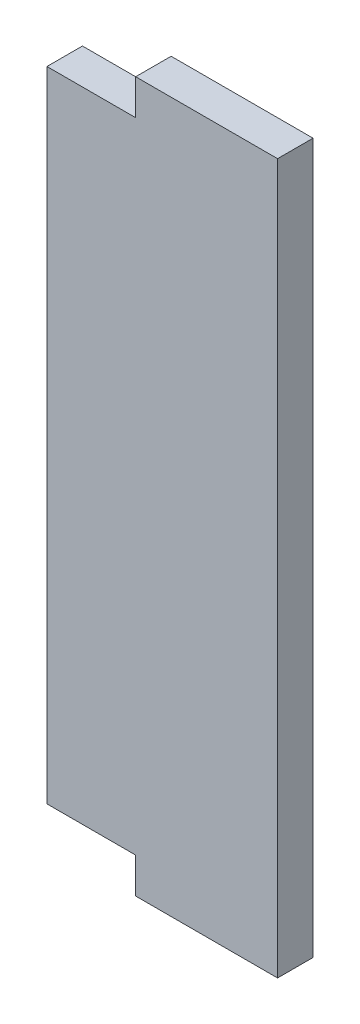
ISO-10303-21;
HEADER;
FILE_DESCRIPTION(('STEP AP214'),'2;1');
FILE_NAME('part.step','',(''),(''),'','','');
FILE_SCHEMA(('AUTOMOTIVE_DESIGN { 1 0 10303 214 1 1 1 1 }'));
ENDSEC;
DATA;
#1=APPLICATION_CONTEXT('core data for automotive mechanical design processes');
#2=APPLICATION_PROTOCOL_DEFINITION('international standard','automotive_design',2000,#1);
#3=PRODUCT_CONTEXT('',#1,'mechanical');
#4=PRODUCT('Part','Part','',(#3));
#5=PRODUCT_RELATED_PRODUCT_CATEGORY('part','',(#4));
#6=PRODUCT_DEFINITION_FORMATION('','',#4);
#7=PRODUCT_DEFINITION_CONTEXT('part definition',#1,'design');
#8=PRODUCT_DEFINITION('design','',#6,#7);
#9=PRODUCT_DEFINITION_SHAPE('','',#8);
#10=(LENGTH_UNIT() NAMED_UNIT(*) SI_UNIT(.MILLI.,.METRE.));
#11=(NAMED_UNIT(*) PLANE_ANGLE_UNIT() SI_UNIT($,.RADIAN.));
#12=(NAMED_UNIT(*) SI_UNIT($,.STERADIAN.) SOLID_ANGLE_UNIT());
#13=UNCERTAINTY_MEASURE_WITH_UNIT(LENGTH_MEASURE(1.E-05),#10,'distance_accuracy_value','');
#14=(GEOMETRIC_REPRESENTATION_CONTEXT(3) GLOBAL_UNCERTAINTY_ASSIGNED_CONTEXT((#13)) GLOBAL_UNIT_ASSIGNED_CONTEXT((#10,
#11,#12)) REPRESENTATION_CONTEXT('',''));
#15=CARTESIAN_POINT('',(0.,0.,0.));
#16=DIRECTION('',(0.,0.,1.));
#17=DIRECTION('',(1.,0.,0.));
#18=AXIS2_PLACEMENT_3D('',#15,#16,#17);
#19=CARTESIAN_POINT('',(0.,60.325,3.175));
#20=DIRECTION('',(0.,-1.,0.));
#21=DIRECTION('',(0.,0.,-1.));
#22=AXIS2_PLACEMENT_3D('',#19,#20,#21);
#23=PLANE('',#22);
#24=DIRECTION('',(-1.,0.,0.));
#25=VECTOR('',#24,1.);
#26=CARTESIAN_POINT('',(0.,60.325,0.));
#27=LINE('',#26,#25);
#28=CARTESIAN_POINT('',(26.9875,60.325,0.));
#29=VERTEX_POINT('',#28);
#30=CARTESIAN_POINT('',(14.2875,60.325,0.));
#31=VERTEX_POINT('',#30);
#32=EDGE_CURVE('E128',#29,#31,#27,.T.);
#33=ORIENTED_EDGE('',*,*,#32,.T.);
#34=DIRECTION('',(0.,0.,-1.));
#35=VECTOR('',#34,1.);
#36=CARTESIAN_POINT('',(14.2875,60.325,3.175));
#37=LINE('',#36,#35);
#38=CARTESIAN_POINT('',(14.2875,60.325,3.175));
#39=VERTEX_POINT('',#38);
#40=EDGE_CURVE('E11',#39,#31,#37,.T.);
#41=ORIENTED_EDGE('',*,*,#40,.F.);
#42=DIRECTION('',(-1.,0.,0.));
#43=VECTOR('',#42,1.);
#44=CARTESIAN_POINT('',(0.,60.325,3.175));
#45=LINE('',#44,#43);
#46=CARTESIAN_POINT('',(26.9875,60.325,3.175));
#47=VERTEX_POINT('',#46);
#48=EDGE_CURVE('E147',#47,#39,#45,.T.);
#49=ORIENTED_EDGE('',*,*,#48,.F.);
#50=DIRECTION('',(0.,0.,-1.));
#51=VECTOR('',#50,1.);
#52=CARTESIAN_POINT('',(26.9875,60.325,3.175));
#53=LINE('',#52,#51);
#54=EDGE_CURVE('E124',#47,#29,#53,.T.);
#55=ORIENTED_EDGE('',*,*,#54,.T.);
#56=EDGE_LOOP('',(#33,#41,#49,#55));
#57=FACE_BOUND('',#56,.T.);
#58=ADVANCED_FACE('F33',(#57),#23,.F.);
#59=CARTESIAN_POINT('',(14.2875,0.,3.175));
#60=DIRECTION('',(1.,0.,0.));
#61=DIRECTION('',(0.,0.,-1.));
#62=AXIS2_PLACEMENT_3D('',#59,#60,#61);
#63=PLANE('',#62);
#64=DIRECTION('',(0.,-1.,0.));
#65=VECTOR('',#64,1.);
#66=CARTESIAN_POINT('',(14.2875,0.,0.));
#67=LINE('',#66,#65);
#68=CARTESIAN_POINT('',(14.2875,57.15,0.));
#69=VERTEX_POINT('',#68);
#70=EDGE_CURVE('E131',#31,#69,#67,.T.);
#71=ORIENTED_EDGE('',*,*,#70,.T.);
#72=DIRECTION('',(0.,0.,-1.));
#73=VECTOR('',#72,1.);
#74=CARTESIAN_POINT('',(14.2875,57.15,3.175));
#75=LINE('',#74,#73);
#76=CARTESIAN_POINT('',(14.2875,57.15,3.175));
#77=VERTEX_POINT('',#76);
#78=EDGE_CURVE('E41',#77,#69,#75,.T.);
#79=ORIENTED_EDGE('',*,*,#78,.F.);
#80=DIRECTION('',(0.,-1.,0.));
#81=VECTOR('',#80,1.);
#82=CARTESIAN_POINT('',(14.2875,0.,3.175));
#83=LINE('',#82,#81);
#84=EDGE_CURVE('E88',#39,#77,#83,.T.);
#85=ORIENTED_EDGE('',*,*,#84,.F.);
#86=ORIENTED_EDGE('',*,*,#40,.T.);
#87=EDGE_LOOP('',(#71,#79,#85,#86));
#88=FACE_BOUND('',#87,.T.);
#89=ADVANCED_FACE('F160',(#88),#63,.F.);
#90=CARTESIAN_POINT('',(0.,57.15,3.175));
#91=DIRECTION('',(0.,1.,0.));
#92=DIRECTION('',(0.,0.,1.));
#93=AXIS2_PLACEMENT_3D('',#90,#91,#92);
#94=PLANE('',#93);
#95=DIRECTION('',(1.,0.,0.));
#96=VECTOR('',#95,1.);
#97=CARTESIAN_POINT('',(0.,57.15,0.));
#98=LINE('',#97,#96);
#99=CARTESIAN_POINT('',(6.35000000000004,57.15,0.));
#100=VERTEX_POINT('',#99);
#101=EDGE_CURVE('E134',#100,#69,#98,.T.);
#102=ORIENTED_EDGE('',*,*,#101,.F.);
#103=DIRECTION('',(0.,0.,-1.));
#104=VECTOR('',#103,1.);
#105=CARTESIAN_POINT('',(6.35000000000004,57.15,3.175));
#106=LINE('',#105,#104);
#107=CARTESIAN_POINT('',(6.35000000000004,57.15,3.175));
#108=VERTEX_POINT('',#107);
#109=EDGE_CURVE('E153',#108,#100,#106,.T.);
#110=ORIENTED_EDGE('',*,*,#109,.F.);
#111=DIRECTION('',(1.,0.,0.));
#112=VECTOR('',#111,1.);
#113=CARTESIAN_POINT('',(0.,57.15,3.175));
#114=LINE('',#113,#112);
#115=EDGE_CURVE('E159',#108,#77,#114,.T.);
#116=ORIENTED_EDGE('',*,*,#115,.T.);
#117=ORIENTED_EDGE('',*,*,#78,.T.);
#118=EDGE_LOOP('',(#102,#110,#116,#117));
#119=FACE_BOUND('',#118,.T.);
#120=ADVANCED_FACE('F157',(#119),#94,.T.);
#121=CARTESIAN_POINT('',(6.35000000000004,0.,3.175));
#122=DIRECTION('',(-1.,0.,0.));
#123=DIRECTION('',(0.,0.,1.));
#124=AXIS2_PLACEMENT_3D('',#121,#122,#123);
#125=PLANE('',#124);
#126=DIRECTION('',(0.,1.,0.));
#127=VECTOR('',#126,1.);
#128=CARTESIAN_POINT('',(6.35000000000004,0.,0.));
#129=LINE('',#128,#127);
#130=CARTESIAN_POINT('',(6.35000000000004,0.,0.));
#131=VERTEX_POINT('',#130);
#132=EDGE_CURVE('E137',#131,#100,#129,.T.);
#133=ORIENTED_EDGE('',*,*,#132,.F.);
#134=DIRECTION('',(0.,0.,-1.));
#135=VECTOR('',#134,1.);
#136=CARTESIAN_POINT('',(6.35000000000004,0.,3.175));
#137=LINE('',#136,#135);
#138=CARTESIAN_POINT('',(6.35000000000004,0.,3.175));
#139=VERTEX_POINT('',#138);
#140=EDGE_CURVE('E151',#139,#131,#137,.T.);
#141=ORIENTED_EDGE('',*,*,#140,.F.);
#142=DIRECTION('',(0.,1.,0.));
#143=VECTOR('',#142,1.);
#144=CARTESIAN_POINT('',(6.35000000000004,0.,3.175));
#145=LINE('',#144,#143);
#146=EDGE_CURVE('E170',#139,#108,#145,.T.);
#147=ORIENTED_EDGE('',*,*,#146,.T.);
#148=ORIENTED_EDGE('',*,*,#109,.T.);
#149=EDGE_LOOP('',(#133,#141,#147,#148));
#150=FACE_BOUND('',#149,.T.);
#151=ADVANCED_FACE('F168',(#150),#125,.T.);
#152=CARTESIAN_POINT('',(0.,0.,3.175));
#153=DIRECTION('',(0.,-1.,0.));
#154=DIRECTION('',(0.,0.,-1.));
#155=AXIS2_PLACEMENT_3D('',#152,#153,#154);
#156=PLANE('',#155);
#157=DIRECTION('',(-1.,0.,0.));
#158=VECTOR('',#157,1.);
#159=CARTESIAN_POINT('',(0.,0.,0.));
#160=LINE('',#159,#158);
#161=CARTESIAN_POINT('',(14.2875,0.,0.));
#162=VERTEX_POINT('',#161);
#163=EDGE_CURVE('E140',#162,#131,#160,.T.);
#164=ORIENTED_EDGE('',*,*,#163,.F.);
#165=DIRECTION('',(0.,0.,-1.));
#166=VECTOR('',#165,1.);
#167=CARTESIAN_POINT('',(14.2875,0.,3.175));
#168=LINE('',#167,#166);
#169=CARTESIAN_POINT('',(14.2875,0.,3.175));
#170=VERTEX_POINT('',#169);
#171=EDGE_CURVE('E113',#170,#162,#168,.T.);
#172=ORIENTED_EDGE('',*,*,#171,.F.);
#173=DIRECTION('',(-1.,0.,0.));
#174=VECTOR('',#173,1.);
#175=CARTESIAN_POINT('',(0.,0.,3.175));
#176=LINE('',#175,#174);
#177=EDGE_CURVE('E120',#170,#139,#176,.T.);
#178=ORIENTED_EDGE('',*,*,#177,.T.);
#179=ORIENTED_EDGE('',*,*,#140,.T.);
#180=EDGE_LOOP('',(#164,#172,#178,#179));
#181=FACE_BOUND('',#180,.T.);
#182=ADVANCED_FACE('F176',(#181),#156,.T.);
#183=CARTESIAN_POINT('',(14.2875,0.,3.175));
#184=DIRECTION('',(-1.,0.,0.));
#185=DIRECTION('',(0.,0.,1.));
#186=AXIS2_PLACEMENT_3D('',#183,#184,#185);
#187=PLANE('',#186);
#188=DIRECTION('',(0.,1.,0.));
#189=VECTOR('',#188,1.);
#190=CARTESIAN_POINT('',(14.2875,0.,0.));
#191=LINE('',#190,#189);
#192=CARTESIAN_POINT('',(14.2875,-3.175,0.));
#193=VERTEX_POINT('',#192);
#194=EDGE_CURVE('E108',#193,#162,#191,.T.);
#195=ORIENTED_EDGE('',*,*,#194,.F.);
#196=DIRECTION('',(0.,0.,-1.));
#197=VECTOR('',#196,1.);
#198=CARTESIAN_POINT('',(14.2875,-3.175,3.175));
#199=LINE('',#198,#197);
#200=CARTESIAN_POINT('',(14.2875,-3.175,3.175));
#201=VERTEX_POINT('',#200);
#202=EDGE_CURVE('E103',#201,#193,#199,.T.);
#203=ORIENTED_EDGE('',*,*,#202,.F.);
#204=DIRECTION('',(0.,1.,0.));
#205=VECTOR('',#204,1.);
#206=CARTESIAN_POINT('',(14.2875,0.,3.175));
#207=LINE('',#206,#205);
#208=EDGE_CURVE('E106',#201,#170,#207,.T.);
#209=ORIENTED_EDGE('',*,*,#208,.T.);
#210=ORIENTED_EDGE('',*,*,#171,.T.);
#211=EDGE_LOOP('',(#195,#203,#209,#210));
#212=FACE_BOUND('',#211,.T.);
#213=ADVANCED_FACE('F105',(#212),#187,.T.);
#214=CARTESIAN_POINT('',(0.,-3.175,3.175));
#215=DIRECTION('',(0.,-1.,0.));
#216=DIRECTION('',(0.,0.,-1.));
#217=AXIS2_PLACEMENT_3D('',#214,#215,#216);
#218=PLANE('',#217);
#219=DIRECTION('',(-1.,0.,0.));
#220=VECTOR('',#219,1.);
#221=CARTESIAN_POINT('',(0.,-3.175,0.));
#222=LINE('',#221,#220);
#223=CARTESIAN_POINT('',(26.9875,-3.175,0.));
#224=VERTEX_POINT('',#223);
#225=EDGE_CURVE('E144',#224,#193,#222,.T.);
#226=ORIENTED_EDGE('',*,*,#225,.F.);
#227=DIRECTION('',(0.,0.,-1.));
#228=VECTOR('',#227,1.);
#229=CARTESIAN_POINT('',(26.9875,-3.175,3.175));
#230=LINE('',#229,#228);
#231=CARTESIAN_POINT('',(26.9875,-3.175,3.175));
#232=VERTEX_POINT('',#231);
#233=EDGE_CURVE('E77',#232,#224,#230,.T.);
#234=ORIENTED_EDGE('',*,*,#233,.F.);
#235=DIRECTION('',(-1.,0.,0.));
#236=VECTOR('',#235,1.);
#237=CARTESIAN_POINT('',(0.,-3.175,3.175));
#238=LINE('',#237,#236);
#239=EDGE_CURVE('E117',#232,#201,#238,.T.);
#240=ORIENTED_EDGE('',*,*,#239,.T.);
#241=ORIENTED_EDGE('',*,*,#202,.T.);
#242=EDGE_LOOP('',(#226,#234,#240,#241));
#243=FACE_BOUND('',#242,.T.);
#244=ADVANCED_FACE('F122',(#243),#218,.T.);
#245=CARTESIAN_POINT('',(26.9875,0.,3.175));
#246=DIRECTION('',(-1.,0.,0.));
#247=DIRECTION('',(0.,0.,1.));
#248=AXIS2_PLACEMENT_3D('',#245,#246,#247);
#249=PLANE('',#248);
#250=DIRECTION('',(0.,1.,0.));
#251=VECTOR('',#250,1.);
#252=CARTESIAN_POINT('',(26.9875,0.,0.));
#253=LINE('',#252,#251);
#254=EDGE_CURVE('E80',#224,#29,#253,.T.);
#255=ORIENTED_EDGE('',*,*,#254,.T.);
#256=ORIENTED_EDGE('',*,*,#54,.F.);
#257=DIRECTION('',(0.,1.,0.));
#258=VECTOR('',#257,1.);
#259=CARTESIAN_POINT('',(26.9875,0.,3.175));
#260=LINE('',#259,#258);
#261=EDGE_CURVE('E49',#232,#47,#260,.T.);
#262=ORIENTED_EDGE('',*,*,#261,.F.);
#263=ORIENTED_EDGE('',*,*,#233,.T.);
#264=EDGE_LOOP('',(#255,#256,#262,#263));
#265=FACE_BOUND('',#264,.T.);
#266=ADVANCED_FACE('F179',(#265),#249,.F.);
#267=CARTESIAN_POINT('',(0.,0.,3.175));
#268=DIRECTION('',(0.,0.,1.));
#269=DIRECTION('',(1.,0.,0.));
#270=AXIS2_PLACEMENT_3D('',#267,#268,#269);
#271=PLANE('',#270);
#272=ORIENTED_EDGE('',*,*,#48,.T.);
#273=ORIENTED_EDGE('',*,*,#84,.T.);
#274=ORIENTED_EDGE('',*,*,#115,.F.);
#275=ORIENTED_EDGE('',*,*,#146,.F.);
#276=ORIENTED_EDGE('',*,*,#177,.F.);
#277=ORIENTED_EDGE('',*,*,#208,.F.);
#278=ORIENTED_EDGE('',*,*,#239,.F.);
#279=ORIENTED_EDGE('',*,*,#261,.T.);
#280=EDGE_LOOP('',(#272,#273,#274,#275,#276,#277,#278,#279));
#281=FACE_BOUND('',#280,.T.);
#282=ADVANCED_FACE('F116',(#281),#271,.T.);
#283=CARTESIAN_POINT('',(0.,0.,0.));
#284=DIRECTION('',(0.,0.,1.));
#285=DIRECTION('',(1.,0.,0.));
#286=AXIS2_PLACEMENT_3D('',#283,#284,#285);
#287=PLANE('',#286);
#288=ORIENTED_EDGE('',*,*,#32,.F.);
#289=ORIENTED_EDGE('',*,*,#254,.F.);
#290=ORIENTED_EDGE('',*,*,#225,.T.);
#291=ORIENTED_EDGE('',*,*,#194,.T.);
#292=ORIENTED_EDGE('',*,*,#163,.T.);
#293=ORIENTED_EDGE('',*,*,#132,.T.);
#294=ORIENTED_EDGE('',*,*,#101,.T.);
#295=ORIENTED_EDGE('',*,*,#70,.F.);
#296=EDGE_LOOP('',(#288,#289,#290,#291,#292,#293,#294,#295));
#297=FACE_BOUND('',#296,.T.);
#298=ADVANCED_FACE('F164',(#297),#287,.F.);
#299=CLOSED_SHELL('',(#58,#89,#120,#151,#182,#213,#244,#266,#282,#298));
#300=MANIFOLD_SOLID_BREP('B2',#299);
#301=ADVANCED_BREP_SHAPE_REPRESENTATION('',(#18,#300),#14);
#302=SHAPE_DEFINITION_REPRESENTATION(#9,#301);
ENDSEC;
END-ISO-10303-21;
